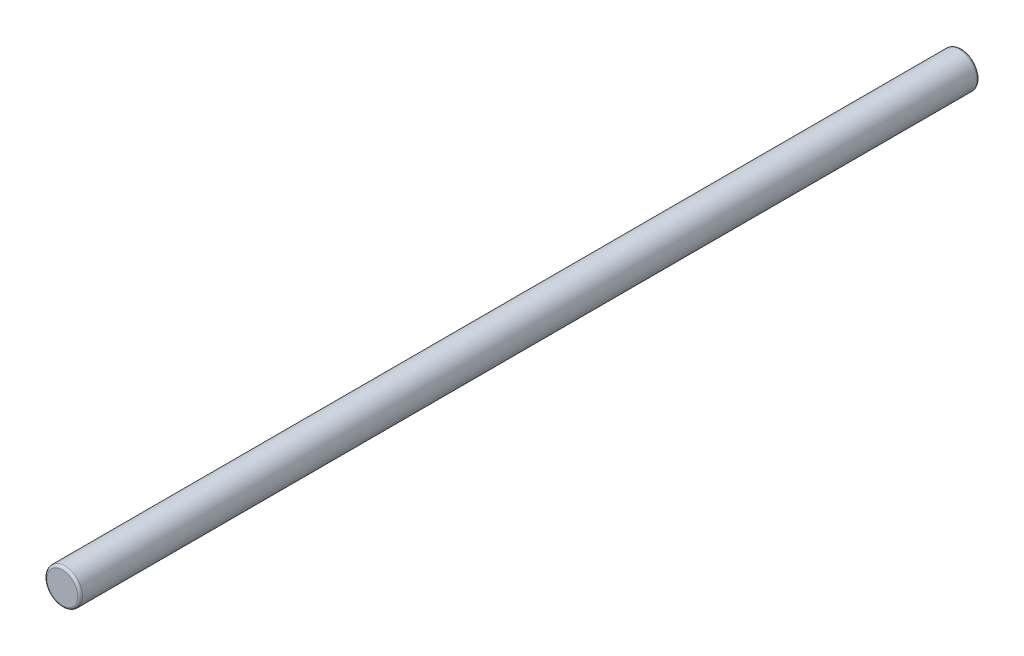
ISO-10303-21;
HEADER;
FILE_DESCRIPTION(('STEP AP214'),'2;1');
FILE_NAME('part.step','',(''),(''),'','','');
FILE_SCHEMA(('AUTOMOTIVE_DESIGN { 1 0 10303 214 1 1 1 1 }'));
ENDSEC;
DATA;
#1=APPLICATION_CONTEXT('core data for automotive mechanical design processes');
#2=APPLICATION_PROTOCOL_DEFINITION('international standard','automotive_design',2000,#1);
#3=PRODUCT_CONTEXT('',#1,'mechanical');
#4=PRODUCT('Part','Part','',(#3));
#5=PRODUCT_RELATED_PRODUCT_CATEGORY('part','',(#4));
#6=PRODUCT_DEFINITION_FORMATION('','',#4);
#7=PRODUCT_DEFINITION_CONTEXT('part definition',#1,'design');
#8=PRODUCT_DEFINITION('design','',#6,#7);
#9=PRODUCT_DEFINITION_SHAPE('','',#8);
#10=(LENGTH_UNIT() NAMED_UNIT(*) SI_UNIT(.MILLI.,.METRE.));
#11=(NAMED_UNIT(*) PLANE_ANGLE_UNIT() SI_UNIT($,.RADIAN.));
#12=(NAMED_UNIT(*) SI_UNIT($,.STERADIAN.) SOLID_ANGLE_UNIT());
#13=UNCERTAINTY_MEASURE_WITH_UNIT(LENGTH_MEASURE(1.E-05),#10,'distance_accuracy_value','');
#14=(GEOMETRIC_REPRESENTATION_CONTEXT(3) GLOBAL_UNCERTAINTY_ASSIGNED_CONTEXT((#13)) GLOBAL_UNIT_ASSIGNED_CONTEXT((#10,
#11,#12)) REPRESENTATION_CONTEXT('',''));
#15=CARTESIAN_POINT('',(0.,0.,0.));
#16=DIRECTION('',(0.,0.,1.));
#17=DIRECTION('',(1.,0.,0.));
#18=AXIS2_PLACEMENT_3D('',#15,#16,#17);
#19=CARTESIAN_POINT('',(0.,0.,76.));
#20=DIRECTION('',(0.,0.,-1.));
#21=DIRECTION('',(-1.,0.,0.));
#22=AXIS2_PLACEMENT_3D('',#19,#20,#21);
#23=CYLINDRICAL_SURFACE('',#22,1.5);
#24=CARTESIAN_POINT('',(0.,0.,0.200000000000006));
#25=DIRECTION('',(0.,0.,1.));
#26=DIRECTION('',(1.,0.,0.));
#27=AXIS2_PLACEMENT_3D('',#24,#25,#26);
#28=CIRCLE('',#27,1.5);
#29=CARTESIAN_POINT('',(1.5,0.,0.200000000000006));
#30=VERTEX_POINT('',#29);
#31=EDGE_CURVE('E52',#30,#30,#28,.T.);
#32=ORIENTED_EDGE('',*,*,#31,.T.);
#33=EDGE_LOOP('',(#32));
#34=FACE_BOUND('',#33,.T.);
#35=CARTESIAN_POINT('',(0.,0.,75.8));
#36=DIRECTION('',(0.,0.,1.));
#37=DIRECTION('',(1.,0.,0.));
#38=AXIS2_PLACEMENT_3D('',#35,#36,#37);
#39=CIRCLE('',#38,1.5);
#40=CARTESIAN_POINT('',(1.5,0.,75.8));
#41=VERTEX_POINT('',#40);
#42=EDGE_CURVE('E56',#41,#41,#39,.F.);
#43=ORIENTED_EDGE('',*,*,#42,.T.);
#44=EDGE_LOOP('',(#43));
#45=FACE_BOUND('',#44,.T.);
#46=ADVANCED_FACE('F41',(#34,#45),#23,.T.);
#47=CARTESIAN_POINT('',(0.,0.,76.));
#48=DIRECTION('',(0.,0.,1.));
#49=DIRECTION('',(1.,0.,0.));
#50=AXIS2_PLACEMENT_3D('',#47,#48,#49);
#51=PLANE('',#50);
#52=CARTESIAN_POINT('',(0.,0.,76.));
#53=DIRECTION('',(0.,0.,1.));
#54=DIRECTION('',(1.,0.,0.));
#55=AXIS2_PLACEMENT_3D('',#52,#53,#54);
#56=CIRCLE('',#55,1.3);
#57=CARTESIAN_POINT('',(1.3,0.,76.));
#58=VERTEX_POINT('',#57);
#59=EDGE_CURVE('E10',#58,#58,#56,.T.);
#60=ORIENTED_EDGE('',*,*,#59,.T.);
#61=EDGE_LOOP('',(#60));
#62=FACE_BOUND('',#61,.T.);
#63=ADVANCED_FACE('F72',(#62),#51,.T.);
#64=CARTESIAN_POINT('',(0.,0.,0.));
#65=DIRECTION('',(0.,0.,1.));
#66=DIRECTION('',(1.,0.,0.));
#67=AXIS2_PLACEMENT_3D('',#64,#65,#66);
#68=PLANE('',#67);
#69=CARTESIAN_POINT('',(0.,0.,0.));
#70=DIRECTION('',(0.,0.,1.));
#71=DIRECTION('',(1.,0.,0.));
#72=AXIS2_PLACEMENT_3D('',#69,#70,#71);
#73=CIRCLE('',#72,1.3);
#74=CARTESIAN_POINT('',(1.3,0.,0.));
#75=VERTEX_POINT('',#74);
#76=EDGE_CURVE('E48',#75,#75,#73,.F.);
#77=ORIENTED_EDGE('',*,*,#76,.T.);
#78=EDGE_LOOP('',(#77));
#79=FACE_BOUND('',#78,.T.);
#80=ADVANCED_FACE('F69',(#79),#68,.F.);
#81=CARTESIAN_POINT('',(0.,0.,0.200000000000006));
#82=DIRECTION('',(0.,0.,1.));
#83=DIRECTION('',(1.,0.,0.));
#84=AXIS2_PLACEMENT_3D('',#81,#82,#83);
#85=TOROIDAL_SURFACE('',#84,1.3,0.2);
#86=ORIENTED_EDGE('',*,*,#76,.F.);
#87=EDGE_LOOP('',(#86));
#88=FACE_BOUND('',#87,.T.);
#89=ORIENTED_EDGE('',*,*,#31,.F.);
#90=EDGE_LOOP('',(#89));
#91=FACE_BOUND('',#90,.T.);
#92=ADVANCED_FACE('F65',(#88,#91),#85,.T.);
#93=CARTESIAN_POINT('',(0.,0.,75.8));
#94=DIRECTION('',(0.,0.,1.));
#95=DIRECTION('',(1.,0.,0.));
#96=AXIS2_PLACEMENT_3D('',#93,#94,#95);
#97=TOROIDAL_SURFACE('',#96,1.3,0.2);
#98=ORIENTED_EDGE('',*,*,#42,.F.);
#99=EDGE_LOOP('',(#98));
#100=FACE_BOUND('',#99,.T.);
#101=ORIENTED_EDGE('',*,*,#59,.F.);
#102=EDGE_LOOP('',(#101));
#103=FACE_BOUND('',#102,.T.);
#104=ADVANCED_FACE('F43',(#100,#103),#97,.T.);
#105=CLOSED_SHELL('',(#46,#63,#80,#92,#104));
#106=MANIFOLD_SOLID_BREP('B2',#105);
#107=ADVANCED_BREP_SHAPE_REPRESENTATION('',(#18,#106),#14);
#108=SHAPE_DEFINITION_REPRESENTATION(#9,#107);
ENDSEC;
END-ISO-10303-21;
